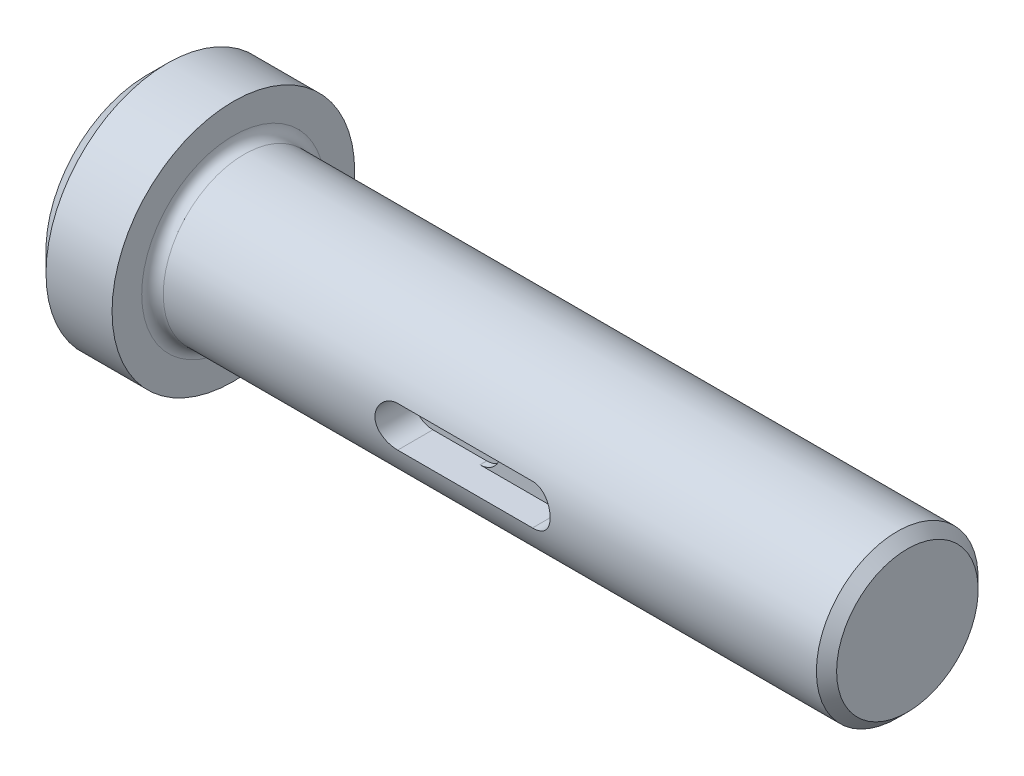
ISO-10303-21;
HEADER;
FILE_DESCRIPTION(('STEP AP214'),'2;1');
FILE_NAME('part.step','',(''),(''),'','','');
FILE_SCHEMA(('AUTOMOTIVE_DESIGN { 1 0 10303 214 1 1 1 1 }'));
ENDSEC;
DATA;
#1=APPLICATION_CONTEXT('core data for automotive mechanical design processes');
#2=APPLICATION_PROTOCOL_DEFINITION('international standard','automotive_design',2000,#1);
#3=PRODUCT_CONTEXT('',#1,'mechanical');
#4=PRODUCT('Part','Part','',(#3));
#5=PRODUCT_RELATED_PRODUCT_CATEGORY('part','',(#4));
#6=PRODUCT_DEFINITION_FORMATION('','',#4);
#7=PRODUCT_DEFINITION_CONTEXT('part definition',#1,'design');
#8=PRODUCT_DEFINITION('design','',#6,#7);
#9=PRODUCT_DEFINITION_SHAPE('','',#8);
#10=(LENGTH_UNIT() NAMED_UNIT(*) SI_UNIT(.MILLI.,.METRE.));
#11=(NAMED_UNIT(*) PLANE_ANGLE_UNIT() SI_UNIT($,.RADIAN.));
#12=(NAMED_UNIT(*) SI_UNIT($,.STERADIAN.) SOLID_ANGLE_UNIT());
#13=UNCERTAINTY_MEASURE_WITH_UNIT(LENGTH_MEASURE(1.E-05),#10,'distance_accuracy_value','');
#14=(GEOMETRIC_REPRESENTATION_CONTEXT(3) GLOBAL_UNCERTAINTY_ASSIGNED_CONTEXT((#13)) GLOBAL_UNIT_ASSIGNED_CONTEXT((#10,
#11,#12)) REPRESENTATION_CONTEXT('',''));
#15=CARTESIAN_POINT('',(0.,0.,0.));
#16=DIRECTION('',(0.,0.,1.));
#17=DIRECTION('',(1.,0.,0.));
#18=AXIS2_PLACEMENT_3D('',#15,#16,#17);
#19=CARTESIAN_POINT('',(7.2,0.,0.));
#20=DIRECTION('',(-1.,0.,0.));
#21=DIRECTION('',(0.,0.,1.));
#22=AXIS2_PLACEMENT_3D('',#19,#20,#21);
#23=TOROIDAL_SURFACE('',#22,6.79999999999999,0.799999999999999);
#24=CARTESIAN_POINT('',(6.4,0.,0.));
#25=DIRECTION('',(-1.,0.,0.));
#26=DIRECTION('',(0.,0.,1.));
#27=AXIS2_PLACEMENT_3D('',#24,#25,#26);
#28=CIRCLE('',#27,6.79999999999998);
#29=CARTESIAN_POINT('',(6.4,0.,6.79999999999998));
#30=VERTEX_POINT('',#29);
#31=EDGE_CURVE('E129',#30,#30,#28,.T.);
#32=ORIENTED_EDGE('',*,*,#31,.F.);
#33=EDGE_LOOP('',(#32));
#34=FACE_BOUND('',#33,.T.);
#35=CARTESIAN_POINT('',(7.2,0.,0.));
#36=DIRECTION('',(-1.,0.,0.));
#37=DIRECTION('',(0.,0.,1.));
#38=AXIS2_PLACEMENT_3D('',#35,#36,#37);
#39=CIRCLE('',#38,5.99999999999999);
#40=CARTESIAN_POINT('',(7.2,0.,5.99999999999999));
#41=VERTEX_POINT('',#40);
#42=EDGE_CURVE('E140',#41,#41,#39,.T.);
#43=ORIENTED_EDGE('',*,*,#42,.T.);
#44=EDGE_LOOP('',(#43));
#45=FACE_BOUND('',#44,.T.);
#46=ADVANCED_FACE('F37',(#34,#45),#23,.F.);
#47=CARTESIAN_POINT('',(-56.0675167785235,0.,0.));
#48=DIRECTION('',(-1.,0.,0.));
#49=DIRECTION('',(0.,0.,1.));
#50=AXIS2_PLACEMENT_3D('',#47,#48,#49);
#51=CYLINDRICAL_SURFACE('',#50,5.99999999999999);
#52=CARTESIAN_POINT('',(55.65,0.,0.));
#53=DIRECTION('',(-1.,0.,0.));
#54=DIRECTION('',(0.,0.,1.));
#55=AXIS2_PLACEMENT_3D('',#52,#53,#54);
#56=CIRCLE('',#55,5.99999999999999);
#57=CARTESIAN_POINT('',(55.65,0.,5.99999999999999));
#58=VERTEX_POINT('',#57);
#59=EDGE_CURVE('E45',#58,#58,#56,.T.);
#60=ORIENTED_EDGE('',*,*,#59,.T.);
#61=EDGE_LOOP('',(#60));
#62=FACE_BOUND('',#61,.T.);
#63=DIRECTION('',(-1.,0.,0.));
#64=VECTOR('',#63,1.);
#65=CARTESIAN_POINT('',(-56.0675167785235,1.5,5.80947501931111));
#66=LINE('',#65,#64);
#67=CARTESIAN_POINT('',(24.4,1.5,5.80947501931111));
#68=VERTEX_POINT('',#67);
#69=CARTESIAN_POINT('',(34.4,1.5,5.80947501931111));
#70=VERTEX_POINT('',#69);
#71=EDGE_CURVE('E328',#68,#70,#66,.F.);
#72=ORIENTED_EDGE('',*,*,#71,.T.);
#73=CARTESIAN_POINT('',(34.4,1.5,5.80947501931111));
#74=CARTESIAN_POINT('',(34.4414944776598,1.50000050624417,5.80947222870264));
#75=CARTESIAN_POINT('',(34.4829683945274,1.49827711106305,5.80992014924205));
#76=CARTESIAN_POINT('',(34.5656060529554,1.49140694309363,5.81168857161837));
#77=CARTESIAN_POINT('',(34.6067698455306,1.48626074635902,5.81300892662529));
#78=CARTESIAN_POINT('',(34.7291797598133,1.46576285907379,5.81822566458079));
#79=CARTESIAN_POINT('',(34.8095847027233,1.44535154275874,5.82337804723212));
#80=CARTESIAN_POINT('',(34.965687010673,1.391697114372,5.83643133882003));
#81=CARTESIAN_POINT('',(35.0413848173193,1.35845520813576,5.84433198946393));
#82=CARTESIAN_POINT('',(35.186167172971,1.2801230670388,5.86198701707907));
#83=CARTESIAN_POINT('',(35.2552499418365,1.2350296550354,5.87174189093469));
#84=CARTESIAN_POINT('',(35.3863158228592,1.13322670774211,5.89224393597036));
#85=CARTESIAN_POINT('',(35.4481323293683,1.07630590317597,5.90300686543372));
#86=CARTESIAN_POINT('',(35.5614531342241,0.952913670774347,5.92417656594289));
#87=CARTESIAN_POINT('',(35.6129557842019,0.886440719218249,5.93458327983804));
#88=CARTESIAN_POINT('',(35.704866502428,0.744685349102539,5.95404273424871));
#89=CARTESIAN_POINT('',(35.745109843976,0.669293010501713,5.96307457022594));
#90=CARTESIAN_POINT('',(35.8122871012951,0.51255388626438,5.97858519375882));
#91=CARTESIAN_POINT('',(35.8392236364498,0.431208276124516,5.9850644837205));
#92=CARTESIAN_POINT('',(35.8784884891662,0.26661616278774,5.99462850007691));
#93=CARTESIAN_POINT('',(35.8911015086342,0.183441483004287,5.9977792935195));
#94=CARTESIAN_POINT('',(35.902255057315,0.0160991635225192,6.00056157226222));
#95=CARTESIAN_POINT('',(35.9007973552885,-0.0680683500430586,6.00019349990165));
#96=CARTESIAN_POINT('',(35.8840550544718,-0.233028739458144,5.99602856048602));
#97=CARTESIAN_POINT('',(35.8690780751008,-0.313855052609782,5.9923079801604));
#98=CARTESIAN_POINT('',(35.8262169812259,-0.471808066626509,5.98194495954742));
#99=CARTESIAN_POINT('',(35.7983322956471,-0.54893460363598,5.97530238998333));
#100=CARTESIAN_POINT('',(35.730198078994,-0.698110929036807,5.95972496642696));
#101=CARTESIAN_POINT('',(35.6898389086508,-0.770108444403371,5.95076990741332));
#102=CARTESIAN_POINT('',(35.5979853052498,-0.906414946845019,5.93153918312878));
#103=CARTESIAN_POINT('',(35.5464891946202,-0.97072277334343,5.92126331899796));
#104=CARTESIAN_POINT('',(35.432181631878,-1.09165408456273,5.90018349034297));
#105=CARTESIAN_POINT('',(35.3691025451903,-1.14802365458119,5.88937275716527));
#106=CARTESIAN_POINT('',(35.2342551996084,-1.24945436277936,5.86869252426008));
#107=CARTESIAN_POINT('',(35.1624845700747,-1.29451240536759,5.85882328264489));
#108=CARTESIAN_POINT('',(35.0117816032644,-1.37220706392894,5.84111720379487));
#109=CARTESIAN_POINT('',(34.9328128026559,-1.4047755268309,5.83329159013704));
#110=CARTESIAN_POINT('',(34.7703246073726,-1.45605352777474,5.82070588210581));
#111=CARTESIAN_POINT('',(34.6868122172753,-1.4747837838182,5.81594120642152));
#112=CARTESIAN_POINT('',(34.5688139288617,-1.49085695272641,5.81182936022285));
#113=CARTESIAN_POINT('',(34.5351204451802,-1.49428618645006,5.81094784666288));
#114=CARTESIAN_POINT('',(34.467623315136,-1.49885513654609,5.8097709373346));
#115=CARTESIAN_POINT('',(34.4338199360671,-1.49999855714407,5.8094745932919));
#116=CARTESIAN_POINT('',(34.4,-1.5,5.80947501931111));
#117=B_SPLINE_CURVE_WITH_KNOTS('',3,(#73,#74,#75,#76,#77,#78,#79,#80,#81,#82,#83,#84,#85,#86,
#87,#88,#89,#90,#91,#92,#93,#94,#95,#96,#97,#98,#99,#100,#101,#102,#103,#104,#105,#106,#107,
#108,#109,#110,#111,#112,#113,#114,#115,#116),.UNSPECIFIED.,.F.,.F.,(4,2,2,2,2,2,2,2,2,2,2,2,2,
2,2,2,2,2,2,2,2,4),(0.,0.124404795509657,0.248788659126974,0.496844944620475,0.744877923137246,
0.992977462090122,1.24596284614196,1.49898863030878,1.75554280647352,2.01204646098637,
2.26335722272987,2.51463639384958,2.76033818218913,3.00605084213757,3.25398764175564,
3.50196181446493,3.75662144301813,4.0113506877145,4.26745080241601,4.52316671309978,
4.62473773083971,4.72614401597506),.UNSPECIFIED.);
#118=CARTESIAN_POINT('',(34.4,-1.5,5.80947501931111));
#119=VERTEX_POINT('',#118);
#120=EDGE_CURVE('E149',#70,#119,#117,.T.);
#121=ORIENTED_EDGE('',*,*,#120,.T.);
#122=DIRECTION('',(-1.,0.,0.));
#123=VECTOR('',#122,1.);
#124=CARTESIAN_POINT('',(-56.0675167785235,-1.50000000000001,5.80947501931111));
#125=LINE('',#124,#123);
#126=CARTESIAN_POINT('',(24.4,-1.50000000000001,5.80947501931111));
#127=VERTEX_POINT('',#126);
#128=EDGE_CURVE('E52',#119,#127,#125,.T.);
#129=ORIENTED_EDGE('',*,*,#128,.T.);
#130=CARTESIAN_POINT('',(24.4,-1.5,5.80947501931111));
#131=CARTESIAN_POINT('',(24.3585055223402,-1.50000050624417,5.80947222870264));
#132=CARTESIAN_POINT('',(24.3170316054727,-1.49827711106305,5.80992014924205));
#133=CARTESIAN_POINT('',(24.2343939470447,-1.49140694309363,5.81168857161837));
#134=CARTESIAN_POINT('',(24.1932301544694,-1.48626074635902,5.81300892662529));
#135=CARTESIAN_POINT('',(24.0708202401867,-1.46576285907379,5.81822566458079));
#136=CARTESIAN_POINT('',(23.9904152972767,-1.44535154275874,5.82337804723212));
#137=CARTESIAN_POINT('',(23.8343129893271,-1.391697114372,5.83643133882003));
#138=CARTESIAN_POINT('',(23.7586151826807,-1.35845520813576,5.84433198946393));
#139=CARTESIAN_POINT('',(23.613832827029,-1.2801230670388,5.86198701707907));
#140=CARTESIAN_POINT('',(23.5447500581636,-1.2350296550354,5.87174189093469));
#141=CARTESIAN_POINT('',(23.4136841771409,-1.1332267077421,5.89224393597036));
#142=CARTESIAN_POINT('',(23.3518676706317,-1.07630590317597,5.90300686543372));
#143=CARTESIAN_POINT('',(23.2385468657759,-0.952913670774348,5.92417656594289));
#144=CARTESIAN_POINT('',(23.1870442157981,-0.88644071921825,5.93458327983804));
#145=CARTESIAN_POINT('',(23.095133497572,-0.744685349102539,5.95404273424871));
#146=CARTESIAN_POINT('',(23.054890156024,-0.669293010501715,5.96307457022594));
#147=CARTESIAN_POINT('',(22.9877128987049,-0.512553886264383,5.97858519375882));
#148=CARTESIAN_POINT('',(22.9607763635503,-0.431208276124518,5.9850644837205));
#149=CARTESIAN_POINT('',(22.9215115108339,-0.266616162787742,5.99462850007691));
#150=CARTESIAN_POINT('',(22.9088984913658,-0.183441483004288,5.9977792935195));
#151=CARTESIAN_POINT('',(22.8977449426851,-0.0160991635225212,6.00056157226222));
#152=CARTESIAN_POINT('',(22.8992026447115,0.0680683500430563,6.00019349990165));
#153=CARTESIAN_POINT('',(22.9159449455282,0.233028739458142,5.99602856048602));
#154=CARTESIAN_POINT('',(22.9309219248992,0.31385505260978,5.9923079801604));
#155=CARTESIAN_POINT('',(22.9737830187741,0.471808066626507,5.98194495954742));
#156=CARTESIAN_POINT('',(23.0016677043529,0.548934603635979,5.97530238998333));
#157=CARTESIAN_POINT('',(23.069801921006,0.698110929036806,5.95972496642696));
#158=CARTESIAN_POINT('',(23.1101610913493,0.77010844440337,5.95076990741332));
#159=CARTESIAN_POINT('',(23.2020146947502,0.906414946845019,5.93153918312878));
#160=CARTESIAN_POINT('',(23.2535108053798,0.970722773343432,5.92126331899796));
#161=CARTESIAN_POINT('',(23.367818368122,1.09165408456273,5.90018349034297));
#162=CARTESIAN_POINT('',(23.4308974548097,1.14802365458119,5.88937275716527));
#163=CARTESIAN_POINT('',(23.5657448003916,1.24945436277935,5.86869252426008));
#164=CARTESIAN_POINT('',(23.6375154299253,1.29451240536759,5.85882328264489));
#165=CARTESIAN_POINT('',(23.7882183967357,1.37220706392894,5.84111720379487));
#166=CARTESIAN_POINT('',(23.8671871973441,1.4047755268309,5.83329159013704));
#167=CARTESIAN_POINT('',(24.0296753926274,1.45605352777474,5.82070588210581));
#168=CARTESIAN_POINT('',(24.1131877827248,1.4747837838182,5.81594120642152));
#169=CARTESIAN_POINT('',(24.2311860711384,1.49085695272641,5.81182936022285));
#170=CARTESIAN_POINT('',(24.2648795548198,1.49428618645006,5.81094784666288));
#171=CARTESIAN_POINT('',(24.332376684864,1.49885513654609,5.8097709373346));
#172=CARTESIAN_POINT('',(24.3661800639329,1.49999855714407,5.8094745932919));
#173=CARTESIAN_POINT('',(24.4,1.5,5.80947501931111));
#174=B_SPLINE_CURVE_WITH_KNOTS('',3,(#130,#131,#132,#133,#134,#135,#136,#137,#138,#139,#140,
#141,#142,#143,#144,#145,#146,#147,#148,#149,#150,#151,#152,#153,#154,#155,#156,#157,#158,#159,
#160,#161,#162,#163,#164,#165,#166,#167,#168,#169,#170,#171,#172,#173),.UNSPECIFIED.,.F.,.F.,(4,
2,2,2,2,2,2,2,2,2,2,2,2,2,2,2,2,2,2,2,2,4),(0.,0.124404795509654,0.248788659126974,
0.496844944620475,0.744877923137247,0.992977462090123,1.24596284614196,1.49898863030879,
1.75554280647352,2.01204646098637,2.26335722272987,2.51463639384958,2.76033818218913,
3.00605084213757,3.25398764175565,3.50196181446493,3.75662144301813,4.01135068771451,
4.26745080241601,4.52316671309978,4.62473773083972,4.72614401597507),.UNSPECIFIED.);
#175=EDGE_CURVE('E56',#127,#68,#174,.T.);
#176=ORIENTED_EDGE('',*,*,#175,.T.);
#177=EDGE_LOOP('',(#72,#121,#129,#176));
#178=FACE_BOUND('',#177,.T.);
#179=ORIENTED_EDGE('',*,*,#42,.F.);
#180=EDGE_LOOP('',(#179));
#181=FACE_BOUND('',#180,.T.);
#182=ADVANCED_FACE('F161',(#62,#178,#181),#51,.T.);
#183=CARTESIAN_POINT('',(56.4,5.99999999999999,0.));
#184=DIRECTION('',(-1.,0.,0.));
#185=DIRECTION('',(0.,0.,1.));
#186=AXIS2_PLACEMENT_3D('',#183,#184,#185);
#187=PLANE('',#186);
#188=CARTESIAN_POINT('',(56.4,0.,0.));
#189=DIRECTION('',(-1.,0.,0.));
#190=DIRECTION('',(0.,0.,1.));
#191=AXIS2_PLACEMENT_3D('',#188,#189,#190);
#192=CIRCLE('',#191,5.24999999999998);
#193=CARTESIAN_POINT('',(56.4,0.,5.24999999999998));
#194=VERTEX_POINT('',#193);
#195=EDGE_CURVE('E11',#194,#194,#192,.F.);
#196=ORIENTED_EDGE('',*,*,#195,.T.);
#197=EDGE_LOOP('',(#196));
#198=FACE_BOUND('',#197,.T.);
#199=ADVANCED_FACE('F189',(#198),#187,.F.);
#200=CARTESIAN_POINT('',(0.,0.,0.));
#201=DIRECTION('',(1.,0.,0.));
#202=DIRECTION('',(0.,0.,-1.));
#203=AXIS2_PLACEMENT_3D('',#200,#201,#202);
#204=PLANE('',#203);
#205=CARTESIAN_POINT('',(0.,0.,0.));
#206=DIRECTION('',(1.,0.,0.));
#207=DIRECTION('',(0.,0.,-1.));
#208=AXIS2_PLACEMENT_3D('',#205,#206,#207);
#209=CIRCLE('',#208,7.49999999999999);
#210=CARTESIAN_POINT('',(0.,0.,-7.49999999999999));
#211=VERTEX_POINT('',#210);
#212=EDGE_CURVE('E143',#211,#211,#209,.F.);
#213=ORIENTED_EDGE('',*,*,#212,.T.);
#214=EDGE_LOOP('',(#213));
#215=FACE_BOUND('',#214,.T.);
#216=ADVANCED_FACE('F186',(#215),#204,.F.);
#217=CARTESIAN_POINT('',(-56.0675167785235,0.,0.));
#218=DIRECTION('',(-1.,0.,0.));
#219=DIRECTION('',(0.,0.,1.));
#220=AXIS2_PLACEMENT_3D('',#217,#218,#219);
#221=CYLINDRICAL_SURFACE('',#220,8.99999999999999);
#222=CARTESIAN_POINT('',(1.5,0.,0.));
#223=DIRECTION('',(1.,0.,0.));
#224=DIRECTION('',(0.,0.,-1.));
#225=AXIS2_PLACEMENT_3D('',#222,#223,#224);
#226=CIRCLE('',#225,8.99999999999999);
#227=CARTESIAN_POINT('',(1.5,0.,-8.99999999999999));
#228=VERTEX_POINT('',#227);
#229=EDGE_CURVE('E146',#228,#228,#226,.T.);
#230=ORIENTED_EDGE('',*,*,#229,.T.);
#231=EDGE_LOOP('',(#230));
#232=FACE_BOUND('',#231,.T.);
#233=CARTESIAN_POINT('',(6.4,0.,0.));
#234=DIRECTION('',(-1.,0.,0.));
#235=DIRECTION('',(0.,0.,1.));
#236=AXIS2_PLACEMENT_3D('',#233,#234,#235);
#237=CIRCLE('',#236,8.99999999999999);
#238=CARTESIAN_POINT('',(6.4,0.,8.99999999999999));
#239=VERTEX_POINT('',#238);
#240=EDGE_CURVE('E137',#239,#239,#237,.T.);
#241=ORIENTED_EDGE('',*,*,#240,.T.);
#242=EDGE_LOOP('',(#241));
#243=FACE_BOUND('',#242,.T.);
#244=ADVANCED_FACE('F182',(#232,#243),#221,.T.);
#245=CARTESIAN_POINT('',(6.4,8.99999999999999,0.));
#246=DIRECTION('',(-1.,0.,0.));
#247=DIRECTION('',(0.,0.,1.));
#248=AXIS2_PLACEMENT_3D('',#245,#246,#247);
#249=PLANE('',#248);
#250=ORIENTED_EDGE('',*,*,#240,.F.);
#251=EDGE_LOOP('',(#250));
#252=FACE_BOUND('',#251,.T.);
#253=ORIENTED_EDGE('',*,*,#31,.T.);
#254=EDGE_LOOP('',(#253));
#255=FACE_BOUND('',#254,.T.);
#256=ADVANCED_FACE('F179',(#252,#255),#249,.F.);
#257=CARTESIAN_POINT('',(0.,0.,0.));
#258=DIRECTION('',(1.,0.,0.));
#259=DIRECTION('',(0.,0.,-1.));
#260=AXIS2_PLACEMENT_3D('',#257,#258,#259);
#261=CONICAL_SURFACE('',#260,7.49999999999999,0.785398163397446);
#262=ORIENTED_EDGE('',*,*,#229,.F.);
#263=EDGE_LOOP('',(#262));
#264=FACE_BOUND('',#263,.T.);
#265=ORIENTED_EDGE('',*,*,#212,.F.);
#266=EDGE_LOOP('',(#265));
#267=FACE_BOUND('',#266,.T.);
#268=ADVANCED_FACE('F178',(#264,#267),#261,.T.);
#269=CARTESIAN_POINT('',(24.4,0.,3.7));
#270=DIRECTION('',(0.,0.,1.));
#271=DIRECTION('',(1.,0.,0.));
#272=AXIS2_PLACEMENT_3D('',#269,#270,#271);
#273=CYLINDRICAL_SURFACE('',#272,1.5);
#274=DIRECTION('',(0.,0.,1.));
#275=VECTOR('',#274,1.);
#276=CARTESIAN_POINT('',(24.4,-1.5,3.7));
#277=LINE('',#276,#275);
#278=CARTESIAN_POINT('',(24.4,-1.5,3.2));
#279=VERTEX_POINT('',#278);
#280=EDGE_CURVE('E88',#279,#127,#277,.T.);
#281=ORIENTED_EDGE('',*,*,#280,.F.);
#282=CARTESIAN_POINT('',(24.4,0.,3.2));
#283=DIRECTION('',(0.,0.,1.));
#284=DIRECTION('',(1.,0.,0.));
#285=AXIS2_PLACEMENT_3D('',#282,#283,#284);
#286=CIRCLE('',#285,1.5);
#287=CARTESIAN_POINT('',(24.4,1.5,3.2));
#288=VERTEX_POINT('',#287);
#289=EDGE_CURVE('E93',#288,#279,#286,.T.);
#290=ORIENTED_EDGE('',*,*,#289,.F.);
#291=DIRECTION('',(0.,0.,1.));
#292=VECTOR('',#291,1.);
#293=CARTESIAN_POINT('',(24.4,1.5,3.7));
#294=LINE('',#293,#292);
#295=EDGE_CURVE('E127',#288,#68,#294,.T.);
#296=ORIENTED_EDGE('',*,*,#295,.T.);
#297=ORIENTED_EDGE('',*,*,#175,.F.);
#298=EDGE_LOOP('',(#281,#290,#296,#297));
#299=FACE_BOUND('',#298,.T.);
#300=ADVANCED_FACE('F90',(#299),#273,.F.);
#301=CARTESIAN_POINT('',(24.4,1.5,3.7));
#302=DIRECTION('',(0.,1.,0.));
#303=DIRECTION('',(0.,0.,1.));
#304=AXIS2_PLACEMENT_3D('',#301,#302,#303);
#305=PLANE('',#304);
#306=ORIENTED_EDGE('',*,*,#295,.F.);
#307=DIRECTION('',(-1.,0.,0.));
#308=VECTOR('',#307,1.);
#309=CARTESIAN_POINT('',(24.4,1.5,3.2));
#310=LINE('',#309,#308);
#311=CARTESIAN_POINT('',(28.4,1.5,3.2));
#312=VERTEX_POINT('',#311);
#313=EDGE_CURVE('E111',#312,#288,#310,.T.);
#314=ORIENTED_EDGE('',*,*,#313,.F.);
#315=DIRECTION('',(0.,0.,1.));
#316=VECTOR('',#315,1.);
#317=CARTESIAN_POINT('',(28.4,1.5,3.2));
#318=LINE('',#317,#316);
#319=CARTESIAN_POINT('',(28.4,1.5,3.7));
#320=VERTEX_POINT('',#319);
#321=EDGE_CURVE('E116',#312,#320,#318,.T.);
#322=ORIENTED_EDGE('',*,*,#321,.T.);
#323=DIRECTION('',(-1.,0.,0.));
#324=VECTOR('',#323,1.);
#325=CARTESIAN_POINT('',(24.4,1.5,3.7));
#326=LINE('',#325,#324);
#327=CARTESIAN_POINT('',(34.4,1.5,3.7));
#328=VERTEX_POINT('',#327);
#329=EDGE_CURVE('E97',#328,#320,#326,.T.);
#330=ORIENTED_EDGE('',*,*,#329,.F.);
#331=DIRECTION('',(0.,0.,1.));
#332=VECTOR('',#331,1.);
#333=CARTESIAN_POINT('',(34.4,1.5,3.7));
#334=LINE('',#333,#332);
#335=EDGE_CURVE('E130',#328,#70,#334,.T.);
#336=ORIENTED_EDGE('',*,*,#335,.T.);
#337=ORIENTED_EDGE('',*,*,#71,.F.);
#338=EDGE_LOOP('',(#306,#314,#322,#330,#336,#337));
#339=FACE_BOUND('',#338,.T.);
#340=ADVANCED_FACE('F170',(#339),#305,.F.);
#341=CARTESIAN_POINT('',(34.4,0.,3.7));
#342=DIRECTION('',(0.,0.,1.));
#343=DIRECTION('',(1.,0.,0.));
#344=AXIS2_PLACEMENT_3D('',#341,#342,#343);
#345=CYLINDRICAL_SURFACE('',#344,1.5);
#346=ORIENTED_EDGE('',*,*,#335,.F.);
#347=CARTESIAN_POINT('',(34.4,0.,3.7));
#348=DIRECTION('',(0.,0.,1.));
#349=DIRECTION('',(-1.,0.,0.));
#350=AXIS2_PLACEMENT_3D('',#347,#348,#349);
#351=CIRCLE('',#350,1.5);
#352=CARTESIAN_POINT('',(34.4,-1.5,3.7));
#353=VERTEX_POINT('',#352);
#354=EDGE_CURVE('E122',#353,#328,#351,.T.);
#355=ORIENTED_EDGE('',*,*,#354,.F.);
#356=DIRECTION('',(0.,0.,1.));
#357=VECTOR('',#356,1.);
#358=CARTESIAN_POINT('',(34.4,-1.5,3.7));
#359=LINE('',#358,#357);
#360=EDGE_CURVE('E96',#353,#119,#359,.T.);
#361=ORIENTED_EDGE('',*,*,#360,.T.);
#362=ORIENTED_EDGE('',*,*,#120,.F.);
#363=EDGE_LOOP('',(#346,#355,#361,#362));
#364=FACE_BOUND('',#363,.T.);
#365=ADVANCED_FACE('F165',(#364),#345,.F.);
#366=CARTESIAN_POINT('',(34.4,-1.5,3.7));
#367=DIRECTION('',(0.,-1.,0.));
#368=DIRECTION('',(1.,0.,0.));
#369=AXIS2_PLACEMENT_3D('',#366,#367,#368);
#370=PLANE('',#369);
#371=DIRECTION('',(1.,0.,0.));
#372=VECTOR('',#371,1.);
#373=CARTESIAN_POINT('',(34.4,-1.5,3.7));
#374=LINE('',#373,#372);
#375=CARTESIAN_POINT('',(28.4,-1.5,3.7));
#376=VERTEX_POINT('',#375);
#377=EDGE_CURVE('E119',#376,#353,#374,.T.);
#378=ORIENTED_EDGE('',*,*,#377,.F.);
#379=DIRECTION('',(0.,0.,1.));
#380=VECTOR('',#379,1.);
#381=CARTESIAN_POINT('',(28.4,-1.5,3.2));
#382=LINE('',#381,#380);
#383=CARTESIAN_POINT('',(28.4,-1.5,3.2));
#384=VERTEX_POINT('',#383);
#385=EDGE_CURVE('E103',#384,#376,#382,.T.);
#386=ORIENTED_EDGE('',*,*,#385,.F.);
#387=DIRECTION('',(1.,0.,0.));
#388=VECTOR('',#387,1.);
#389=CARTESIAN_POINT('',(28.4,-1.5,3.2));
#390=LINE('',#389,#388);
#391=EDGE_CURVE('E100',#279,#384,#390,.T.);
#392=ORIENTED_EDGE('',*,*,#391,.F.);
#393=ORIENTED_EDGE('',*,*,#280,.T.);
#394=ORIENTED_EDGE('',*,*,#128,.F.);
#395=ORIENTED_EDGE('',*,*,#360,.F.);
#396=EDGE_LOOP('',(#378,#386,#392,#393,#394,#395));
#397=FACE_BOUND('',#396,.T.);
#398=ADVANCED_FACE('F102',(#397),#370,.F.);
#399=CARTESIAN_POINT('',(24.4,0.,3.7));
#400=DIRECTION('',(0.,0.,-1.));
#401=DIRECTION('',(-1.,0.,0.));
#402=AXIS2_PLACEMENT_3D('',#399,#400,#401);
#403=PLANE('',#402);
#404=ORIENTED_EDGE('',*,*,#329,.T.);
#405=CARTESIAN_POINT('',(28.4,0.,3.7));
#406=DIRECTION('',(0.,0.,-1.));
#407=DIRECTION('',(-1.,0.,0.));
#408=AXIS2_PLACEMENT_3D('',#405,#406,#407);
#409=CIRCLE('',#408,1.5);
#410=EDGE_CURVE('E326',#320,#376,#409,.T.);
#411=ORIENTED_EDGE('',*,*,#410,.T.);
#412=ORIENTED_EDGE('',*,*,#377,.T.);
#413=ORIENTED_EDGE('',*,*,#354,.T.);
#414=EDGE_LOOP('',(#404,#411,#412,#413));
#415=FACE_BOUND('',#414,.T.);
#416=ADVANCED_FACE('F174',(#415),#403,.F.);
#417=CARTESIAN_POINT('',(28.4,0.,3.2));
#418=DIRECTION('',(0.,0.,1.));
#419=DIRECTION('',(1.,0.,0.));
#420=AXIS2_PLACEMENT_3D('',#417,#418,#419);
#421=CYLINDRICAL_SURFACE('',#420,1.5);
#422=ORIENTED_EDGE('',*,*,#321,.F.);
#423=CARTESIAN_POINT('',(28.4,0.,3.2));
#424=DIRECTION('',(0.,0.,1.));
#425=DIRECTION('',(1.,0.,0.));
#426=AXIS2_PLACEMENT_3D('',#423,#424,#425);
#427=CIRCLE('',#426,1.5);
#428=EDGE_CURVE('E107',#384,#312,#427,.T.);
#429=ORIENTED_EDGE('',*,*,#428,.F.);
#430=ORIENTED_EDGE('',*,*,#385,.T.);
#431=ORIENTED_EDGE('',*,*,#410,.F.);
#432=EDGE_LOOP('',(#422,#429,#430,#431));
#433=FACE_BOUND('',#432,.T.);
#434=ADVANCED_FACE('F240',(#433),#421,.F.);
#435=CARTESIAN_POINT('',(24.4,0.,3.2));
#436=DIRECTION('',(0.,0.,1.));
#437=DIRECTION('',(1.,0.,0.));
#438=AXIS2_PLACEMENT_3D('',#435,#436,#437);
#439=PLANE('',#438);
#440=ORIENTED_EDGE('',*,*,#289,.T.);
#441=ORIENTED_EDGE('',*,*,#391,.T.);
#442=ORIENTED_EDGE('',*,*,#428,.T.);
#443=ORIENTED_EDGE('',*,*,#313,.T.);
#444=EDGE_LOOP('',(#440,#441,#442,#443));
#445=FACE_BOUND('',#444,.T.);
#446=ADVANCED_FACE('F109',(#445),#439,.T.);
#447=CARTESIAN_POINT('',(55.65,0.,0.));
#448=DIRECTION('',(-1.,0.,0.));
#449=DIRECTION('',(0.,0.,1.));
#450=AXIS2_PLACEMENT_3D('',#447,#448,#449);
#451=CONICAL_SURFACE('',#450,5.99999999999999,0.785398163397449);
#452=ORIENTED_EDGE('',*,*,#195,.F.);
#453=EDGE_LOOP('',(#452));
#454=FACE_BOUND('',#453,.T.);
#455=ORIENTED_EDGE('',*,*,#59,.F.);
#456=EDGE_LOOP('',(#455));
#457=FACE_BOUND('',#456,.T.);
#458=ADVANCED_FACE('F39',(#454,#457),#451,.T.);
#459=CLOSED_SHELL('',(#46,#182,#199,#216,#244,#256,#268,#300,#340,#365,#398,#416,#434,#446,#458));
#460=MANIFOLD_SOLID_BREP('B2',#459);
#461=ADVANCED_BREP_SHAPE_REPRESENTATION('',(#18,#460),#14);
#462=SHAPE_DEFINITION_REPRESENTATION(#9,#461);
ENDSEC;
END-ISO-10303-21;
